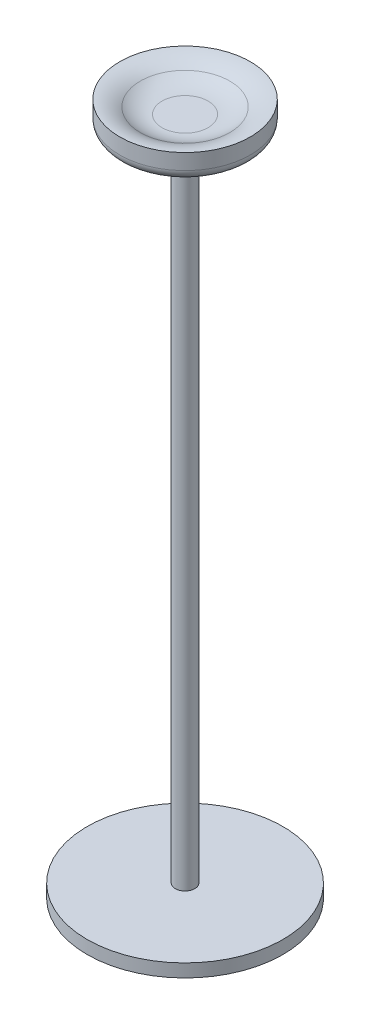
ISO-10303-21;
HEADER;
FILE_DESCRIPTION(('STEP AP214'),'2;1');
FILE_NAME('part.step','',(''),(''),'','','');
FILE_SCHEMA(('AUTOMOTIVE_DESIGN { 1 0 10303 214 1 1 1 1 }'));
ENDSEC;
DATA;
#1=APPLICATION_CONTEXT('core data for automotive mechanical design processes');
#2=APPLICATION_PROTOCOL_DEFINITION('international standard','automotive_design',2000,#1);
#3=PRODUCT_CONTEXT('',#1,'mechanical');
#4=PRODUCT('Part','Part','',(#3));
#5=PRODUCT_RELATED_PRODUCT_CATEGORY('part','',(#4));
#6=PRODUCT_DEFINITION_FORMATION('','',#4);
#7=PRODUCT_DEFINITION_CONTEXT('part definition',#1,'design');
#8=PRODUCT_DEFINITION('design','',#6,#7);
#9=PRODUCT_DEFINITION_SHAPE('','',#8);
#10=(LENGTH_UNIT() NAMED_UNIT(*) SI_UNIT(.MILLI.,.METRE.));
#11=(NAMED_UNIT(*) PLANE_ANGLE_UNIT() SI_UNIT($,.RADIAN.));
#12=(NAMED_UNIT(*) SI_UNIT($,.STERADIAN.) SOLID_ANGLE_UNIT());
#13=UNCERTAINTY_MEASURE_WITH_UNIT(LENGTH_MEASURE(1.E-05),#10,'distance_accuracy_value','');
#14=(GEOMETRIC_REPRESENTATION_CONTEXT(3) GLOBAL_UNCERTAINTY_ASSIGNED_CONTEXT((#13)) GLOBAL_UNIT_ASSIGNED_CONTEXT((#10,
#11,#12)) REPRESENTATION_CONTEXT('',''));
#15=CARTESIAN_POINT('',(0.,0.,0.));
#16=DIRECTION('',(0.,0.,1.));
#17=DIRECTION('',(1.,0.,0.));
#18=AXIS2_PLACEMENT_3D('',#15,#16,#17);
#19=CARTESIAN_POINT('',(0.,10.,0.));
#20=DIRECTION('',(0.,1.,0.));
#21=DIRECTION('',(0.,0.,1.));
#22=AXIS2_PLACEMENT_3D('',#19,#20,#21);
#23=PLANE('',#22);
#24=CARTESIAN_POINT('',(0.,10.,0.));
#25=DIRECTION('',(0.,1.,0.));
#26=DIRECTION('',(0.,0.,1.));
#27=AXIS2_PLACEMENT_3D('',#24,#25,#26);
#28=CIRCLE('',#27,75.);
#29=CARTESIAN_POINT('',(0.,10.,75.));
#30=VERTEX_POINT('',#29);
#31=EDGE_CURVE('E59',#30,#30,#28,.T.);
#32=ORIENTED_EDGE('',*,*,#31,.T.);
#33=EDGE_LOOP('',(#32));
#34=FACE_BOUND('',#33,.T.);
#35=CARTESIAN_POINT('',(0.,10.,0.));
#36=DIRECTION('',(0.,1.,0.));
#37=DIRECTION('',(0.,0.,1.));
#38=AXIS2_PLACEMENT_3D('',#35,#36,#37);
#39=CIRCLE('',#38,7.5);
#40=CARTESIAN_POINT('',(0.,10.,7.5));
#41=VERTEX_POINT('',#40);
#42=EDGE_CURVE('E63',#41,#41,#39,.T.);
#43=ORIENTED_EDGE('',*,*,#42,.F.);
#44=EDGE_LOOP('',(#43));
#45=FACE_BOUND('',#44,.T.);
#46=ADVANCED_FACE('F33',(#34,#45),#23,.T.);
#47=CARTESIAN_POINT('',(0.,10.,0.));
#48=DIRECTION('',(0.,-1.,0.));
#49=DIRECTION('',(0.,0.,-1.));
#50=AXIS2_PLACEMENT_3D('',#47,#48,#49);
#51=CYLINDRICAL_SURFACE('',#50,75.);
#52=ORIENTED_EDGE('',*,*,#31,.F.);
#53=EDGE_LOOP('',(#52));
#54=FACE_BOUND('',#53,.T.);
#55=CARTESIAN_POINT('',(0.,0.,0.));
#56=DIRECTION('',(0.,1.,0.));
#57=DIRECTION('',(0.,0.,1.));
#58=AXIS2_PLACEMENT_3D('',#55,#56,#57);
#59=CIRCLE('',#58,75.);
#60=CARTESIAN_POINT('',(0.,0.,75.));
#61=VERTEX_POINT('',#60);
#62=EDGE_CURVE('E60',#61,#61,#59,.T.);
#63=ORIENTED_EDGE('',*,*,#62,.T.);
#64=EDGE_LOOP('',(#63));
#65=FACE_BOUND('',#64,.T.);
#66=ADVANCED_FACE('F92',(#54,#65),#51,.T.);
#67=CARTESIAN_POINT('',(0.,0.,0.));
#68=DIRECTION('',(0.,1.,0.));
#69=DIRECTION('',(0.,0.,1.));
#70=AXIS2_PLACEMENT_3D('',#67,#68,#69);
#71=PLANE('',#70);
#72=ORIENTED_EDGE('',*,*,#62,.F.);
#73=EDGE_LOOP('',(#72));
#74=FACE_BOUND('',#73,.T.);
#75=ADVANCED_FACE('F98',(#74),#71,.F.);
#76=CARTESIAN_POINT('',(0.,510.,0.));
#77=DIRECTION('',(0.,-1.,0.));
#78=DIRECTION('',(0.,0.,-1.));
#79=AXIS2_PLACEMENT_3D('',#76,#77,#78);
#80=CYLINDRICAL_SURFACE('',#79,7.5);
#81=CARTESIAN_POINT('',(0.,502.,0.));
#82=DIRECTION('',(0.,1.,0.));
#83=DIRECTION('',(0.,0.,1.));
#84=AXIS2_PLACEMENT_3D('',#81,#82,#83);
#85=CIRCLE('',#84,7.5);
#86=CARTESIAN_POINT('',(0.,502.,7.5));
#87=VERTEX_POINT('',#86);
#88=EDGE_CURVE('E48',#87,#87,#85,.F.);
#89=ORIENTED_EDGE('',*,*,#88,.T.);
#90=EDGE_LOOP('',(#89));
#91=FACE_BOUND('',#90,.T.);
#92=ORIENTED_EDGE('',*,*,#42,.T.);
#93=EDGE_LOOP('',(#92));
#94=FACE_BOUND('',#93,.T.);
#95=ADVANCED_FACE('F87',(#91,#94),#80,.T.);
#96=CARTESIAN_POINT('',(0.,510.,0.));
#97=DIRECTION('',(0.,1.,0.));
#98=DIRECTION('',(0.,0.,1.));
#99=AXIS2_PLACEMENT_3D('',#96,#97,#98);
#100=PLANE('',#99);
#101=CARTESIAN_POINT('',(0.,510.,0.));
#102=DIRECTION('',(0.,1.,0.));
#103=DIRECTION('',(0.,0.,1.));
#104=AXIS2_PLACEMENT_3D('',#101,#102,#103);
#105=CIRCLE('',#104,15.5);
#106=CARTESIAN_POINT('',(0.,510.,15.5));
#107=VERTEX_POINT('',#106);
#108=EDGE_CURVE('E53',#107,#107,#105,.T.);
#109=ORIENTED_EDGE('',*,*,#108,.T.);
#110=EDGE_LOOP('',(#109));
#111=FACE_BOUND('',#110,.T.);
#112=CARTESIAN_POINT('',(0.,510.,0.));
#113=DIRECTION('',(0.,1.,0.));
#114=DIRECTION('',(0.,0.,1.));
#115=AXIS2_PLACEMENT_3D('',#112,#113,#114);
#116=CIRCLE('',#115,42.);
#117=CARTESIAN_POINT('',(0.,510.,42.));
#118=VERTEX_POINT('',#117);
#119=EDGE_CURVE('E56',#118,#118,#116,.F.);
#120=ORIENTED_EDGE('',*,*,#119,.T.);
#121=EDGE_LOOP('',(#120));
#122=FACE_BOUND('',#121,.T.);
#123=ADVANCED_FACE('F77',(#111,#122),#100,.F.);
#124=CARTESIAN_POINT('',(0.,530.,0.));
#125=DIRECTION('',(0.,-1.,0.));
#126=DIRECTION('',(0.,0.,-1.));
#127=AXIS2_PLACEMENT_3D('',#124,#125,#126);
#128=CYLINDRICAL_SURFACE('',#127,50.);
#129=CARTESIAN_POINT('',(0.,518.,0.));
#130=DIRECTION('',(0.,1.,0.));
#131=DIRECTION('',(0.,0.,1.));
#132=AXIS2_PLACEMENT_3D('',#129,#130,#131);
#133=CIRCLE('',#132,50.);
#134=CARTESIAN_POINT('',(0.,518.,50.));
#135=VERTEX_POINT('',#134);
#136=EDGE_CURVE('E44',#135,#135,#133,.T.);
#137=ORIENTED_EDGE('',*,*,#136,.T.);
#138=EDGE_LOOP('',(#137));
#139=FACE_BOUND('',#138,.T.);
#140=CARTESIAN_POINT('',(0.,530.,0.));
#141=DIRECTION('',(0.,1.,0.));
#142=DIRECTION('',(0.,0.,1.));
#143=AXIS2_PLACEMENT_3D('',#140,#141,#142);
#144=CIRCLE('',#143,50.);
#145=CARTESIAN_POINT('',(0.,530.,50.));
#146=VERTEX_POINT('',#145);
#147=EDGE_CURVE('E68',#146,#146,#144,.T.);
#148=ORIENTED_EDGE('',*,*,#147,.F.);
#149=EDGE_LOOP('',(#148));
#150=FACE_BOUND('',#149,.T.);
#151=ADVANCED_FACE('F74',(#139,#150),#128,.T.);
#152=CARTESIAN_POINT('',(0.,502.,0.));
#153=DIRECTION('',(0.,1.,0.));
#154=DIRECTION('',(0.,0.,1.));
#155=AXIS2_PLACEMENT_3D('',#152,#153,#154);
#156=TOROIDAL_SURFACE('',#155,15.5,8.);
#157=ORIENTED_EDGE('',*,*,#88,.F.);
#158=EDGE_LOOP('',(#157));
#159=FACE_BOUND('',#158,.T.);
#160=ORIENTED_EDGE('',*,*,#108,.F.);
#161=EDGE_LOOP('',(#160));
#162=FACE_BOUND('',#161,.T.);
#163=ADVANCED_FACE('F76',(#159,#162),#156,.F.);
#164=CARTESIAN_POINT('',(0.,518.,0.));
#165=DIRECTION('',(0.,1.,0.));
#166=DIRECTION('',(0.,0.,1.));
#167=AXIS2_PLACEMENT_3D('',#164,#165,#166);
#168=TOROIDAL_SURFACE('',#167,42.,8.);
#169=ORIENTED_EDGE('',*,*,#119,.F.);
#170=EDGE_LOOP('',(#169));
#171=FACE_BOUND('',#170,.T.);
#172=ORIENTED_EDGE('',*,*,#136,.F.);
#173=EDGE_LOOP('',(#172));
#174=FACE_BOUND('',#173,.T.);
#175=ADVANCED_FACE('F84',(#171,#174),#168,.T.);
#176=CARTESIAN_POINT('',(0.,520.,0.));
#177=DIRECTION('',(0.,1.,0.));
#178=DIRECTION('',(0.,0.,1.));
#179=AXIS2_PLACEMENT_3D('',#176,#177,#178);
#180=PLANE('',#179);
#181=CARTESIAN_POINT('',(0.,520.,0.));
#182=DIRECTION('',(0.,1.,0.));
#183=DIRECTION('',(0.,0.,1.));
#184=AXIS2_PLACEMENT_3D('',#181,#182,#183);
#185=CIRCLE('',#184,17.6485079839656);
#186=CARTESIAN_POINT('',(0.,520.,17.6485079839656));
#187=VERTEX_POINT('',#186);
#188=EDGE_CURVE('E40',#187,#187,#185,.T.);
#189=ORIENTED_EDGE('',*,*,#188,.T.);
#190=EDGE_LOOP('',(#189));
#191=FACE_BOUND('',#190,.T.);
#192=ADVANCED_FACE('F107',(#191),#180,.T.);
#193=CARTESIAN_POINT('',(0.,550.,0.));
#194=DIRECTION('',(0.,-1.,0.));
#195=DIRECTION('',(0.,0.,-1.));
#196=AXIS2_PLACEMENT_3D('',#193,#194,#195);
#197=DEGENERATE_TOROIDAL_SURFACE('',#196,17.6485079839656,30.,.T.);
#198=CARTESIAN_POINT('',(0.,525.005771748839,0.));
#199=DIRECTION('',(0.,1.,0.));
#200=DIRECTION('',(0.,0.,1.));
#201=AXIS2_PLACEMENT_3D('',#198,#199,#200);
#202=CIRCLE('',#201,34.2403298890149);
#203=CARTESIAN_POINT('',(0.,525.005771748839,34.2403298890149));
#204=VERTEX_POINT('',#203);
#205=EDGE_CURVE('E10',#204,#204,#202,.T.);
#206=ORIENTED_EDGE('',*,*,#205,.T.);
#207=EDGE_LOOP('',(#206));
#208=FACE_BOUND('',#207,.T.);
#209=ORIENTED_EDGE('',*,*,#188,.F.);
#210=EDGE_LOOP('',(#209));
#211=FACE_BOUND('',#210,.T.);
#212=ADVANCED_FACE('F109',(#208,#211),#197,.F.);
#213=CARTESIAN_POINT('',(0.,500.011543497678,0.));
#214=DIRECTION('',(0.,1.,0.));
#215=DIRECTION('',(0.,0.,1.));
#216=AXIS2_PLACEMENT_3D('',#213,#214,#215);
#217=TOROIDAL_SURFACE('',#216,50.8321517940643,30.);
#218=ORIENTED_EDGE('',*,*,#147,.T.);
#219=EDGE_LOOP('',(#218));
#220=FACE_BOUND('',#219,.T.);
#221=ORIENTED_EDGE('',*,*,#205,.F.);
#222=EDGE_LOOP('',(#221));
#223=FACE_BOUND('',#222,.T.);
#224=ADVANCED_FACE('F35',(#220,#223),#217,.T.);
#225=CLOSED_SHELL('',(#46,#66,#75,#95,#123,#151,#163,#175,#192,#212,#224));
#226=MANIFOLD_SOLID_BREP('B2',#225);
#227=ADVANCED_BREP_SHAPE_REPRESENTATION('',(#18,#226),#14);
#228=SHAPE_DEFINITION_REPRESENTATION(#9,#227);
ENDSEC;
END-ISO-10303-21;
